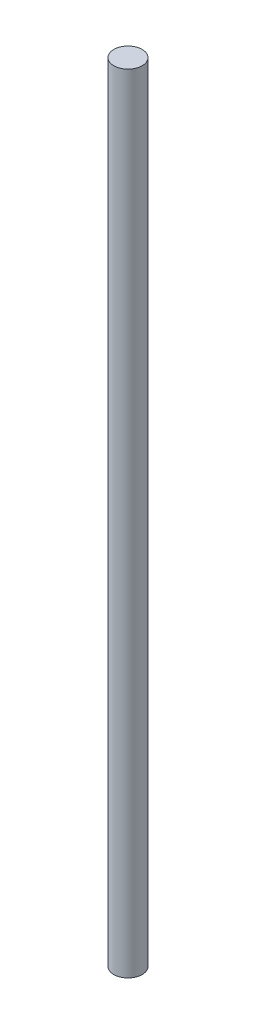
ISO-10303-21;
HEADER;
FILE_DESCRIPTION(('STEP AP214'),'2;1');
FILE_NAME('part.step','',(''),(''),'','','');
FILE_SCHEMA(('AUTOMOTIVE_DESIGN { 1 0 10303 214 1 1 1 1 }'));
ENDSEC;
DATA;
#1=APPLICATION_CONTEXT('core data for automotive mechanical design processes');
#2=APPLICATION_PROTOCOL_DEFINITION('international standard','automotive_design',2000,#1);
#3=PRODUCT_CONTEXT('',#1,'mechanical');
#4=PRODUCT('Part','Part','',(#3));
#5=PRODUCT_RELATED_PRODUCT_CATEGORY('part','',(#4));
#6=PRODUCT_DEFINITION_FORMATION('','',#4);
#7=PRODUCT_DEFINITION_CONTEXT('part definition',#1,'design');
#8=PRODUCT_DEFINITION('design','',#6,#7);
#9=PRODUCT_DEFINITION_SHAPE('','',#8);
#10=(LENGTH_UNIT() NAMED_UNIT(*) SI_UNIT(.MILLI.,.METRE.));
#11=(NAMED_UNIT(*) PLANE_ANGLE_UNIT() SI_UNIT($,.RADIAN.));
#12=(NAMED_UNIT(*) SI_UNIT($,.STERADIAN.) SOLID_ANGLE_UNIT());
#13=UNCERTAINTY_MEASURE_WITH_UNIT(LENGTH_MEASURE(1.E-05),#10,'distance_accuracy_value','');
#14=(GEOMETRIC_REPRESENTATION_CONTEXT(3) GLOBAL_UNCERTAINTY_ASSIGNED_CONTEXT((#13)) GLOBAL_UNIT_ASSIGNED_CONTEXT((#10,
#11,#12)) REPRESENTATION_CONTEXT('',''));
#15=CARTESIAN_POINT('',(0.,0.,0.));
#16=DIRECTION('',(0.,0.,1.));
#17=DIRECTION('',(1.,0.,0.));
#18=AXIS2_PLACEMENT_3D('',#15,#16,#17);
#19=CARTESIAN_POINT('',(0.,62.5,0.));
#20=DIRECTION('',(0.,-1.,0.));
#21=DIRECTION('',(0.,0.,-1.));
#22=AXIS2_PLACEMENT_3D('',#19,#20,#21);
#23=CYLINDRICAL_SURFACE('',#22,2.25);
#24=CARTESIAN_POINT('',(0.,62.5,0.));
#25=DIRECTION('',(0.,1.,0.));
#26=DIRECTION('',(0.,0.,1.));
#27=AXIS2_PLACEMENT_3D('',#24,#25,#26);
#28=CIRCLE('',#27,2.25);
#29=CARTESIAN_POINT('',(0.,62.5,2.25));
#30=VERTEX_POINT('',#29);
#31=EDGE_CURVE('E10',#30,#30,#28,.T.);
#32=ORIENTED_EDGE('',*,*,#31,.F.);
#33=EDGE_LOOP('',(#32));
#34=FACE_BOUND('',#33,.T.);
#35=CARTESIAN_POINT('',(0.,-62.5,0.));
#36=DIRECTION('',(0.,1.,0.));
#37=DIRECTION('',(0.,0.,1.));
#38=AXIS2_PLACEMENT_3D('',#35,#36,#37);
#39=CIRCLE('',#38,2.25);
#40=CARTESIAN_POINT('',(0.,-62.5,2.25));
#41=VERTEX_POINT('',#40);
#42=EDGE_CURVE('E40',#41,#41,#39,.T.);
#43=ORIENTED_EDGE('',*,*,#42,.T.);
#44=EDGE_LOOP('',(#43));
#45=FACE_BOUND('',#44,.T.);
#46=ADVANCED_FACE('F37',(#34,#45),#23,.T.);
#47=CARTESIAN_POINT('',(0.,62.5,0.));
#48=DIRECTION('',(0.,1.,0.));
#49=DIRECTION('',(0.,0.,1.));
#50=AXIS2_PLACEMENT_3D('',#47,#48,#49);
#51=PLANE('',#50);
#52=ORIENTED_EDGE('',*,*,#31,.T.);
#53=EDGE_LOOP('',(#52));
#54=FACE_BOUND('',#53,.T.);
#55=ADVANCED_FACE('F52',(#54),#51,.T.);
#56=CARTESIAN_POINT('',(0.,-62.5,0.));
#57=DIRECTION('',(0.,1.,0.));
#58=DIRECTION('',(0.,0.,1.));
#59=AXIS2_PLACEMENT_3D('',#56,#57,#58);
#60=PLANE('',#59);
#61=ORIENTED_EDGE('',*,*,#42,.F.);
#62=EDGE_LOOP('',(#61));
#63=FACE_BOUND('',#62,.T.);
#64=ADVANCED_FACE('F50',(#63),#60,.F.);
#65=CLOSED_SHELL('',(#46,#55,#64));
#66=MANIFOLD_SOLID_BREP('B2',#65);
#67=ADVANCED_BREP_SHAPE_REPRESENTATION('',(#18,#66),#14);
#68=SHAPE_DEFINITION_REPRESENTATION(#9,#67);
ENDSEC;
END-ISO-10303-21;
